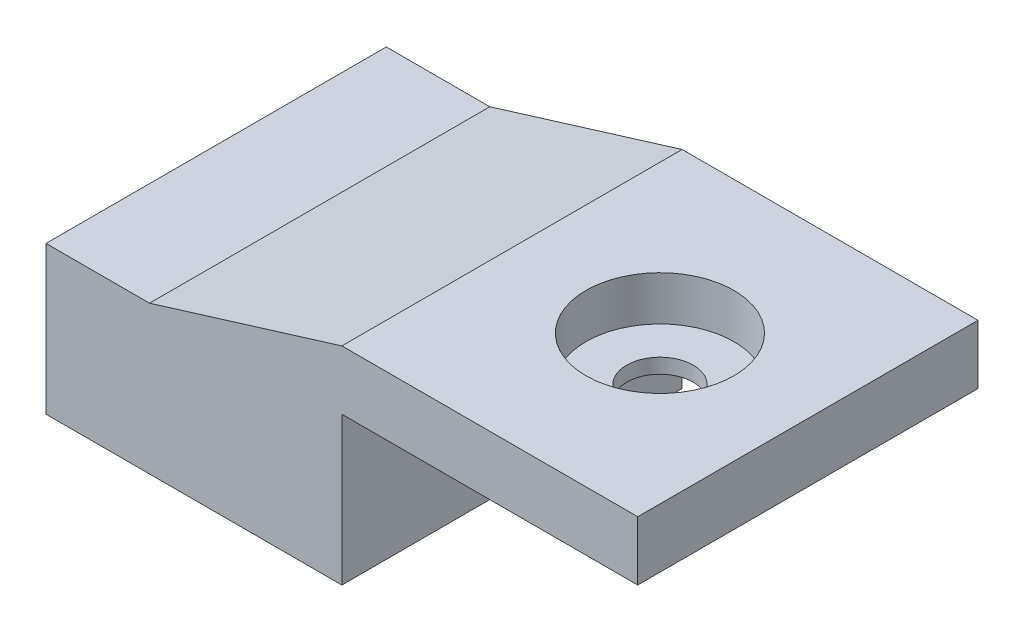
ISO-10303-21;
HEADER;
FILE_DESCRIPTION(('STEP AP214'),'2;1');
FILE_NAME('part.step','',(''),(''),'','','');
FILE_SCHEMA(('AUTOMOTIVE_DESIGN { 1 0 10303 214 1 1 1 1 }'));
ENDSEC;
DATA;
#1=APPLICATION_CONTEXT('core data for automotive mechanical design processes');
#2=APPLICATION_PROTOCOL_DEFINITION('international standard','automotive_design',2000,#1);
#3=PRODUCT_CONTEXT('',#1,'mechanical');
#4=PRODUCT('Part','Part','',(#3));
#5=PRODUCT_RELATED_PRODUCT_CATEGORY('part','',(#4));
#6=PRODUCT_DEFINITION_FORMATION('','',#4);
#7=PRODUCT_DEFINITION_CONTEXT('part definition',#1,'design');
#8=PRODUCT_DEFINITION('design','',#6,#7);
#9=PRODUCT_DEFINITION_SHAPE('','',#8);
#10=(LENGTH_UNIT() NAMED_UNIT(*) SI_UNIT(.MILLI.,.METRE.));
#11=(NAMED_UNIT(*) PLANE_ANGLE_UNIT() SI_UNIT($,.RADIAN.));
#12=(NAMED_UNIT(*) SI_UNIT($,.STERADIAN.) SOLID_ANGLE_UNIT());
#13=UNCERTAINTY_MEASURE_WITH_UNIT(LENGTH_MEASURE(1.E-05),#10,'distance_accuracy_value','');
#14=(GEOMETRIC_REPRESENTATION_CONTEXT(3) GLOBAL_UNCERTAINTY_ASSIGNED_CONTEXT((#13)) GLOBAL_UNIT_ASSIGNED_CONTEXT((#10,
#11,#12)) REPRESENTATION_CONTEXT('',''));
#15=CARTESIAN_POINT('',(0.,0.,0.));
#16=DIRECTION('',(0.,0.,1.));
#17=DIRECTION('',(1.,0.,0.));
#18=AXIS2_PLACEMENT_3D('',#15,#16,#17);
#19=CARTESIAN_POINT('',(0.,10.,23.));
#20=DIRECTION('',(1.,0.,0.));
#21=DIRECTION('',(0.,0.,-1.));
#22=AXIS2_PLACEMENT_3D('',#19,#20,#21);
#23=PLANE('',#22);
#24=CARTESIAN_POINT('',(0.,3.886151,5.));
#25=DIRECTION('',(-1.,0.,0.));
#26=DIRECTION('',(0.,0.,1.));
#27=AXIS2_PLACEMENT_3D('',#24,#25,#26);
#28=CIRCLE('',#27,2.8);
#29=CARTESIAN_POINT('',(0.,3.886151,7.8));
#30=VERTEX_POINT('',#29);
#31=EDGE_CURVE('E194',#30,#30,#28,.T.);
#32=ORIENTED_EDGE('',*,*,#31,.F.);
#33=EDGE_LOOP('',(#32));
#34=FACE_BOUND('',#33,.T.);
#35=CARTESIAN_POINT('',(0.,3.886151,18.));
#36=DIRECTION('',(-1.,0.,0.));
#37=DIRECTION('',(0.,0.,1.));
#38=AXIS2_PLACEMENT_3D('',#35,#36,#37);
#39=CIRCLE('',#38,2.8);
#40=CARTESIAN_POINT('',(0.,3.886151,20.8));
#41=VERTEX_POINT('',#40);
#42=EDGE_CURVE('E188',#41,#41,#39,.T.);
#43=ORIENTED_EDGE('',*,*,#42,.F.);
#44=EDGE_LOOP('',(#43));
#45=FACE_BOUND('',#44,.T.);
#46=DIRECTION('',(0.,-1.,0.));
#47=VECTOR('',#46,1.);
#48=CARTESIAN_POINT('',(0.,10.,0.));
#49=LINE('',#48,#47);
#50=CARTESIAN_POINT('',(0.,10.,0.));
#51=VERTEX_POINT('',#50);
#52=CARTESIAN_POINT('',(0.,0.,0.));
#53=VERTEX_POINT('',#52);
#54=EDGE_CURVE('E137',#51,#53,#49,.T.);
#55=ORIENTED_EDGE('',*,*,#54,.T.);
#56=DIRECTION('',(0.,0.,-1.));
#57=VECTOR('',#56,1.);
#58=CARTESIAN_POINT('',(0.,0.,23.));
#59=LINE('',#58,#57);
#60=CARTESIAN_POINT('',(0.,0.,23.));
#61=VERTEX_POINT('',#60);
#62=EDGE_CURVE('E11',#61,#53,#59,.T.);
#63=ORIENTED_EDGE('',*,*,#62,.F.);
#64=DIRECTION('',(0.,-1.,0.));
#65=VECTOR('',#64,1.);
#66=CARTESIAN_POINT('',(0.,10.,23.));
#67=LINE('',#66,#65);
#68=CARTESIAN_POINT('',(0.,10.,23.));
#69=VERTEX_POINT('',#68);
#70=EDGE_CURVE('E152',#69,#61,#67,.T.);
#71=ORIENTED_EDGE('',*,*,#70,.F.);
#72=DIRECTION('',(0.,0.,-1.));
#73=VECTOR('',#72,1.);
#74=CARTESIAN_POINT('',(0.,10.,23.));
#75=LINE('',#74,#73);
#76=EDGE_CURVE('E133',#69,#51,#75,.T.);
#77=ORIENTED_EDGE('',*,*,#76,.T.);
#78=EDGE_LOOP('',(#55,#63,#71,#77));
#79=FACE_BOUND('',#78,.T.);
#80=ADVANCED_FACE('F37',(#34,#45,#79),#23,.F.);
#81=CARTESIAN_POINT('',(0.,0.,23.));
#82=DIRECTION('',(0.,1.,0.));
#83=DIRECTION('',(0.,0.,1.));
#84=AXIS2_PLACEMENT_3D('',#81,#82,#83);
#85=PLANE('',#84);
#86=DIRECTION('',(1.,0.,0.));
#87=VECTOR('',#86,1.);
#88=CARTESIAN_POINT('',(0.,0.,0.));
#89=LINE('',#88,#87);
#90=CARTESIAN_POINT('',(20.,0.,0.));
#91=VERTEX_POINT('',#90);
#92=EDGE_CURVE('E140',#53,#91,#89,.T.);
#93=ORIENTED_EDGE('',*,*,#92,.T.);
#94=DIRECTION('',(0.,0.,-1.));
#95=VECTOR('',#94,1.);
#96=CARTESIAN_POINT('',(20.,0.,23.));
#97=LINE('',#96,#95);
#98=CARTESIAN_POINT('',(20.,0.,23.));
#99=VERTEX_POINT('',#98);
#100=EDGE_CURVE('E46',#99,#91,#97,.T.);
#101=ORIENTED_EDGE('',*,*,#100,.F.);
#102=DIRECTION('',(1.,0.,0.));
#103=VECTOR('',#102,1.);
#104=CARTESIAN_POINT('',(0.,0.,23.));
#105=LINE('',#104,#103);
#106=EDGE_CURVE('E98',#61,#99,#105,.T.);
#107=ORIENTED_EDGE('',*,*,#106,.F.);
#108=ORIENTED_EDGE('',*,*,#62,.T.);
#109=EDGE_LOOP('',(#93,#101,#107,#108));
#110=FACE_BOUND('',#109,.T.);
#111=ADVANCED_FACE('F219',(#110),#85,.F.);
#112=CARTESIAN_POINT('',(20.,0.,23.));
#113=DIRECTION('',(-1.,0.,0.));
#114=DIRECTION('',(0.,0.,1.));
#115=AXIS2_PLACEMENT_3D('',#112,#113,#114);
#116=PLANE('',#115);
#117=DIRECTION('',(0.,1.,0.));
#118=VECTOR('',#117,1.);
#119=CARTESIAN_POINT('',(20.,0.,0.));
#120=LINE('',#119,#118);
#121=CARTESIAN_POINT('',(20.,10.,0.));
#122=VERTEX_POINT('',#121);
#123=EDGE_CURVE('E143',#91,#122,#120,.T.);
#124=ORIENTED_EDGE('',*,*,#123,.T.);
#125=DIRECTION('',(0.,0.,-1.));
#126=VECTOR('',#125,1.);
#127=CARTESIAN_POINT('',(20.,10.,23.));
#128=LINE('',#127,#126);
#129=CARTESIAN_POINT('',(20.,10.,23.));
#130=VERTEX_POINT('',#129);
#131=EDGE_CURVE('E159',#130,#122,#128,.T.);
#132=ORIENTED_EDGE('',*,*,#131,.F.);
#133=DIRECTION('',(0.,1.,0.));
#134=VECTOR('',#133,1.);
#135=CARTESIAN_POINT('',(20.,0.,23.));
#136=LINE('',#135,#134);
#137=EDGE_CURVE('E168',#99,#130,#136,.T.);
#138=ORIENTED_EDGE('',*,*,#137,.F.);
#139=ORIENTED_EDGE('',*,*,#100,.T.);
#140=EDGE_LOOP('',(#124,#132,#138,#139));
#141=FACE_BOUND('',#140,.T.);
#142=ADVANCED_FACE('F166',(#141),#116,.F.);
#143=CARTESIAN_POINT('',(20.,10.,23.));
#144=DIRECTION('',(0.,1.,0.));
#145=DIRECTION('',(0.,0.,1.));
#146=AXIS2_PLACEMENT_3D('',#143,#144,#145);
#147=PLANE('',#146);
#148=CARTESIAN_POINT('',(30.,10.,11.5));
#149=DIRECTION('',(0.,1.,0.));
#150=DIRECTION('',(0.,0.,1.));
#151=AXIS2_PLACEMENT_3D('',#148,#149,#150);
#152=CIRCLE('',#151,2.25);
#153=CARTESIAN_POINT('',(30.,10.,13.75));
#154=VERTEX_POINT('',#153);
#155=EDGE_CURVE('E40',#154,#154,#152,.T.);
#156=ORIENTED_EDGE('',*,*,#155,.T.);
#157=EDGE_LOOP('',(#156));
#158=FACE_BOUND('',#157,.T.);
#159=DIRECTION('',(1.,0.,0.));
#160=VECTOR('',#159,1.);
#161=CARTESIAN_POINT('',(20.,10.,0.));
#162=LINE('',#161,#160);
#163=CARTESIAN_POINT('',(40.,10.,0.));
#164=VERTEX_POINT('',#163);
#165=EDGE_CURVE('E145',#122,#164,#162,.T.);
#166=ORIENTED_EDGE('',*,*,#165,.T.);
#167=DIRECTION('',(0.,0.,-1.));
#168=VECTOR('',#167,1.);
#169=CARTESIAN_POINT('',(40.,10.,23.));
#170=LINE('',#169,#168);
#171=CARTESIAN_POINT('',(40.,10.,23.));
#172=VERTEX_POINT('',#171);
#173=EDGE_CURVE('E156',#172,#164,#170,.T.);
#174=ORIENTED_EDGE('',*,*,#173,.F.);
#175=DIRECTION('',(1.,0.,0.));
#176=VECTOR('',#175,1.);
#177=CARTESIAN_POINT('',(20.,10.,23.));
#178=LINE('',#177,#176);
#179=EDGE_CURVE('E180',#130,#172,#178,.T.);
#180=ORIENTED_EDGE('',*,*,#179,.F.);
#181=ORIENTED_EDGE('',*,*,#131,.T.);
#182=EDGE_LOOP('',(#166,#174,#180,#181));
#183=FACE_BOUND('',#182,.T.);
#184=ADVANCED_FACE('F176',(#158,#183),#147,.F.);
#185=CARTESIAN_POINT('',(40.,10.,23.));
#186=DIRECTION('',(-1.,0.,0.));
#187=DIRECTION('',(0.,-1.,0.));
#188=AXIS2_PLACEMENT_3D('',#185,#186,#187);
#189=PLANE('',#188);
#190=DIRECTION('',(0.,1.,0.));
#191=VECTOR('',#190,1.);
#192=CARTESIAN_POINT('',(40.,10.,0.));
#193=LINE('',#192,#191);
#194=CARTESIAN_POINT('',(40.,14.,0.));
#195=VERTEX_POINT('',#194);
#196=EDGE_CURVE('E147',#164,#195,#193,.T.);
#197=ORIENTED_EDGE('',*,*,#196,.T.);
#198=DIRECTION('',(0.,0.,-1.));
#199=VECTOR('',#198,1.);
#200=CARTESIAN_POINT('',(40.,14.,23.));
#201=LINE('',#200,#199);
#202=CARTESIAN_POINT('',(40.,14.,23.));
#203=VERTEX_POINT('',#202);
#204=EDGE_CURVE('E128',#203,#195,#201,.T.);
#205=ORIENTED_EDGE('',*,*,#204,.F.);
#206=DIRECTION('',(0.,1.,0.));
#207=VECTOR('',#206,1.);
#208=CARTESIAN_POINT('',(40.,10.,23.));
#209=LINE('',#208,#207);
#210=EDGE_CURVE('E119',#172,#203,#209,.T.);
#211=ORIENTED_EDGE('',*,*,#210,.F.);
#212=ORIENTED_EDGE('',*,*,#173,.T.);
#213=EDGE_LOOP('',(#197,#205,#211,#212));
#214=FACE_BOUND('',#213,.T.);
#215=ADVANCED_FACE('F179',(#214),#189,.F.);
#216=CARTESIAN_POINT('',(40.,14.,23.));
#217=DIRECTION('',(0.,-1.,0.));
#218=DIRECTION('',(1.,0.,0.));
#219=AXIS2_PLACEMENT_3D('',#216,#217,#218);
#220=PLANE('',#219);
#221=CARTESIAN_POINT('',(30.,14.,11.5));
#222=DIRECTION('',(0.,1.,0.));
#223=DIRECTION('',(0.,0.,1.));
#224=AXIS2_PLACEMENT_3D('',#221,#222,#223);
#225=CIRCLE('',#224,5.);
#226=CARTESIAN_POINT('',(30.,14.,16.5));
#227=VERTEX_POINT('',#226);
#228=EDGE_CURVE('E203',#227,#227,#225,.T.);
#229=ORIENTED_EDGE('',*,*,#228,.F.);
#230=EDGE_LOOP('',(#229));
#231=FACE_BOUND('',#230,.T.);
#232=DIRECTION('',(-1.,0.,0.));
#233=VECTOR('',#232,1.);
#234=CARTESIAN_POINT('',(40.,14.,0.));
#235=LINE('',#234,#233);
#236=CARTESIAN_POINT('',(20.,14.,0.));
#237=VERTEX_POINT('',#236);
#238=EDGE_CURVE('E127',#195,#237,#235,.T.);
#239=ORIENTED_EDGE('',*,*,#238,.T.);
#240=DIRECTION('',(0.,0.,-1.));
#241=VECTOR('',#240,1.);
#242=CARTESIAN_POINT('',(20.,14.,23.));
#243=LINE('',#242,#241);
#244=CARTESIAN_POINT('',(20.,14.,23.));
#245=VERTEX_POINT('',#244);
#246=EDGE_CURVE('E124',#245,#237,#243,.T.);
#247=ORIENTED_EDGE('',*,*,#246,.F.);
#248=DIRECTION('',(-1.,0.,0.));
#249=VECTOR('',#248,1.);
#250=CARTESIAN_POINT('',(40.,14.,23.));
#251=LINE('',#250,#249);
#252=EDGE_CURVE('E113',#203,#245,#251,.T.);
#253=ORIENTED_EDGE('',*,*,#252,.F.);
#254=ORIENTED_EDGE('',*,*,#204,.T.);
#255=EDGE_LOOP('',(#239,#247,#253,#254));
#256=FACE_BOUND('',#255,.T.);
#257=ADVANCED_FACE('F125',(#231,#256),#220,.F.);
#258=CARTESIAN_POINT('',(7.,10.,23.));
#259=DIRECTION('',(0.294085848837523,-0.95577900872195,0.));
#260=DIRECTION('',(0.95577900872195,0.294085848837523,0.));
#261=AXIS2_PLACEMENT_3D('',#258,#259,#260);
#262=PLANE('',#261);
#263=DIRECTION('',(-0.95577900872195,-0.294085848837524,0.));
#264=VECTOR('',#263,1.);
#265=CARTESIAN_POINT('',(7.,10.,0.));
#266=LINE('',#265,#264);
#267=CARTESIAN_POINT('',(7.,10.,0.));
#268=VERTEX_POINT('',#267);
#269=EDGE_CURVE('E84',#237,#268,#266,.T.);
#270=ORIENTED_EDGE('',*,*,#269,.T.);
#271=DIRECTION('',(0.,0.,-1.));
#272=VECTOR('',#271,1.);
#273=CARTESIAN_POINT('',(7.,10.,23.));
#274=LINE('',#273,#272);
#275=CARTESIAN_POINT('',(7.,10.,23.));
#276=VERTEX_POINT('',#275);
#277=EDGE_CURVE('E129',#276,#268,#274,.T.);
#278=ORIENTED_EDGE('',*,*,#277,.F.);
#279=DIRECTION('',(-0.95577900872195,-0.294085848837524,0.));
#280=VECTOR('',#279,1.);
#281=CARTESIAN_POINT('',(7.,10.,23.));
#282=LINE('',#281,#280);
#283=EDGE_CURVE('E117',#245,#276,#282,.T.);
#284=ORIENTED_EDGE('',*,*,#283,.F.);
#285=ORIENTED_EDGE('',*,*,#246,.T.);
#286=EDGE_LOOP('',(#270,#278,#284,#285));
#287=FACE_BOUND('',#286,.T.);
#288=ADVANCED_FACE('F131',(#287),#262,.F.);
#289=CARTESIAN_POINT('',(0.,10.,23.));
#290=DIRECTION('',(0.,-1.,0.));
#291=DIRECTION('',(0.,0.,-1.));
#292=AXIS2_PLACEMENT_3D('',#289,#290,#291);
#293=PLANE('',#292);
#294=DIRECTION('',(-1.,0.,0.));
#295=VECTOR('',#294,1.);
#296=CARTESIAN_POINT('',(0.,10.,0.));
#297=LINE('',#296,#295);
#298=EDGE_CURVE('E90',#268,#51,#297,.T.);
#299=ORIENTED_EDGE('',*,*,#298,.T.);
#300=ORIENTED_EDGE('',*,*,#76,.F.);
#301=DIRECTION('',(-1.,0.,0.));
#302=VECTOR('',#301,1.);
#303=CARTESIAN_POINT('',(0.,10.,23.));
#304=LINE('',#303,#302);
#305=EDGE_CURVE('E54',#276,#69,#304,.T.);
#306=ORIENTED_EDGE('',*,*,#305,.F.);
#307=ORIENTED_EDGE('',*,*,#277,.T.);
#308=EDGE_LOOP('',(#299,#300,#306,#307));
#309=FACE_BOUND('',#308,.T.);
#310=ADVANCED_FACE('F215',(#309),#293,.F.);
#311=CARTESIAN_POINT('',(0.,0.,23.));
#312=DIRECTION('',(0.,0.,1.));
#313=DIRECTION('',(1.,0.,0.));
#314=AXIS2_PLACEMENT_3D('',#311,#312,#313);
#315=PLANE('',#314);
#316=ORIENTED_EDGE('',*,*,#70,.T.);
#317=ORIENTED_EDGE('',*,*,#106,.T.);
#318=ORIENTED_EDGE('',*,*,#137,.T.);
#319=ORIENTED_EDGE('',*,*,#179,.T.);
#320=ORIENTED_EDGE('',*,*,#210,.T.);
#321=ORIENTED_EDGE('',*,*,#252,.T.);
#322=ORIENTED_EDGE('',*,*,#283,.T.);
#323=ORIENTED_EDGE('',*,*,#305,.T.);
#324=EDGE_LOOP('',(#316,#317,#318,#319,#320,#321,#322,#323));
#325=FACE_BOUND('',#324,.T.);
#326=ADVANCED_FACE('F115',(#325),#315,.T.);
#327=CARTESIAN_POINT('',(0.,0.,0.));
#328=DIRECTION('',(0.,0.,1.));
#329=DIRECTION('',(1.,0.,0.));
#330=AXIS2_PLACEMENT_3D('',#327,#328,#329);
#331=PLANE('',#330);
#332=ORIENTED_EDGE('',*,*,#54,.F.);
#333=ORIENTED_EDGE('',*,*,#298,.F.);
#334=ORIENTED_EDGE('',*,*,#269,.F.);
#335=ORIENTED_EDGE('',*,*,#238,.F.);
#336=ORIENTED_EDGE('',*,*,#196,.F.);
#337=ORIENTED_EDGE('',*,*,#165,.F.);
#338=ORIENTED_EDGE('',*,*,#123,.F.);
#339=ORIENTED_EDGE('',*,*,#92,.F.);
#340=EDGE_LOOP('',(#332,#333,#334,#335,#336,#337,#338,#339));
#341=FACE_BOUND('',#340,.T.);
#342=ADVANCED_FACE('F172',(#341),#331,.F.);
#343=CARTESIAN_POINT('',(10.,3.886151,18.));
#344=DIRECTION('',(-1.,0.,0.));
#345=DIRECTION('',(0.,0.,1.));
#346=AXIS2_PLACEMENT_3D('',#343,#344,#345);
#347=CONICAL_SURFACE('',#346,2.8,1.02974425867665);
#348=CARTESIAN_POINT('',(11.6824097332772,3.886151,18.));
#349=VERTEX_POINT('',#348);
#350=VERTEX_LOOP('',#349);
#351=FACE_BOUND('',#350,.T.);
#352=CARTESIAN_POINT('',(10.,3.886151,18.));
#353=DIRECTION('',(-1.,0.,0.));
#354=DIRECTION('',(0.,0.,1.));
#355=AXIS2_PLACEMENT_3D('',#352,#353,#354);
#356=CIRCLE('',#355,2.8);
#357=CARTESIAN_POINT('',(10.,3.886151,20.8));
#358=VERTEX_POINT('',#357);
#359=EDGE_CURVE('E141',#358,#358,#356,.T.);
#360=ORIENTED_EDGE('',*,*,#359,.T.);
#361=EDGE_LOOP('',(#360));
#362=FACE_BOUND('',#361,.T.);
#363=ADVANCED_FACE('F238',(#351,#362),#347,.F.);
#364=CARTESIAN_POINT('',(0.,3.886151,18.));
#365=DIRECTION('',(-1.,0.,0.));
#366=DIRECTION('',(0.,0.,1.));
#367=AXIS2_PLACEMENT_3D('',#364,#365,#366);
#368=CYLINDRICAL_SURFACE('',#367,2.8);
#369=ORIENTED_EDGE('',*,*,#359,.F.);
#370=EDGE_LOOP('',(#369));
#371=FACE_BOUND('',#370,.T.);
#372=ORIENTED_EDGE('',*,*,#42,.T.);
#373=EDGE_LOOP('',(#372));
#374=FACE_BOUND('',#373,.T.);
#375=ADVANCED_FACE('F242',(#371,#374),#368,.F.);
#376=CARTESIAN_POINT('',(10.,3.886151,5.));
#377=DIRECTION('',(-1.,0.,0.));
#378=DIRECTION('',(0.,0.,1.));
#379=AXIS2_PLACEMENT_3D('',#376,#377,#378);
#380=CONICAL_SURFACE('',#379,2.8,1.02974425867665);
#381=CARTESIAN_POINT('',(11.6824097332772,3.886151,5.));
#382=VERTEX_POINT('',#381);
#383=VERTEX_LOOP('',#382);
#384=FACE_BOUND('',#383,.T.);
#385=CARTESIAN_POINT('',(10.,3.886151,5.));
#386=DIRECTION('',(-1.,0.,0.));
#387=DIRECTION('',(0.,0.,1.));
#388=AXIS2_PLACEMENT_3D('',#385,#386,#387);
#389=CIRCLE('',#388,2.8);
#390=CARTESIAN_POINT('',(10.,3.886151,7.8));
#391=VERTEX_POINT('',#390);
#392=EDGE_CURVE('E191',#391,#391,#389,.T.);
#393=ORIENTED_EDGE('',*,*,#392,.T.);
#394=EDGE_LOOP('',(#393));
#395=FACE_BOUND('',#394,.T.);
#396=ADVANCED_FACE('F246',(#384,#395),#380,.F.);
#397=CARTESIAN_POINT('',(0.,3.886151,5.));
#398=DIRECTION('',(-1.,0.,0.));
#399=DIRECTION('',(0.,0.,1.));
#400=AXIS2_PLACEMENT_3D('',#397,#398,#399);
#401=CYLINDRICAL_SURFACE('',#400,2.8);
#402=ORIENTED_EDGE('',*,*,#392,.F.);
#403=EDGE_LOOP('',(#402));
#404=FACE_BOUND('',#403,.T.);
#405=ORIENTED_EDGE('',*,*,#31,.T.);
#406=EDGE_LOOP('',(#405));
#407=FACE_BOUND('',#406,.T.);
#408=ADVANCED_FACE('F250',(#404,#407),#401,.F.);
#409=CARTESIAN_POINT('',(30.,14.,11.5));
#410=DIRECTION('',(0.,1.,0.));
#411=DIRECTION('',(0.,0.,1.));
#412=AXIS2_PLACEMENT_3D('',#409,#410,#411);
#413=CYLINDRICAL_SURFACE('',#412,2.25);
#414=CARTESIAN_POINT('',(30.,11.,11.5));
#415=DIRECTION('',(0.,1.,0.));
#416=DIRECTION('',(0.,0.,1.));
#417=AXIS2_PLACEMENT_3D('',#414,#415,#416);
#418=CIRCLE('',#417,2.25);
#419=CARTESIAN_POINT('',(30.,11.,13.75));
#420=VERTEX_POINT('',#419);
#421=EDGE_CURVE('E197',#420,#420,#418,.T.);
#422=ORIENTED_EDGE('',*,*,#421,.T.);
#423=EDGE_LOOP('',(#422));
#424=FACE_BOUND('',#423,.T.);
#425=ORIENTED_EDGE('',*,*,#155,.F.);
#426=EDGE_LOOP('',(#425));
#427=FACE_BOUND('',#426,.T.);
#428=ADVANCED_FACE('F254',(#424,#427),#413,.F.);
#429=CARTESIAN_POINT('',(32.25,11.,11.5));
#430=DIRECTION('',(0.,-1.,0.));
#431=DIRECTION('',(0.,0.,-1.));
#432=AXIS2_PLACEMENT_3D('',#429,#430,#431);
#433=PLANE('',#432);
#434=ORIENTED_EDGE('',*,*,#421,.F.);
#435=EDGE_LOOP('',(#434));
#436=FACE_BOUND('',#435,.T.);
#437=CARTESIAN_POINT('',(30.,11.,11.5));
#438=DIRECTION('',(0.,1.,0.));
#439=DIRECTION('',(0.,0.,1.));
#440=AXIS2_PLACEMENT_3D('',#437,#438,#439);
#441=CIRCLE('',#440,5.);
#442=CARTESIAN_POINT('',(30.,11.,16.5));
#443=VERTEX_POINT('',#442);
#444=EDGE_CURVE('E200',#443,#443,#441,.T.);
#445=ORIENTED_EDGE('',*,*,#444,.T.);
#446=EDGE_LOOP('',(#445));
#447=FACE_BOUND('',#446,.T.);
#448=ADVANCED_FACE('F258',(#436,#447),#433,.F.);
#449=CARTESIAN_POINT('',(30.,14.,11.5));
#450=DIRECTION('',(0.,1.,0.));
#451=DIRECTION('',(0.,0.,1.));
#452=AXIS2_PLACEMENT_3D('',#449,#450,#451);
#453=CYLINDRICAL_SURFACE('',#452,5.);
#454=ORIENTED_EDGE('',*,*,#444,.F.);
#455=EDGE_LOOP('',(#454));
#456=FACE_BOUND('',#455,.T.);
#457=ORIENTED_EDGE('',*,*,#228,.T.);
#458=EDGE_LOOP('',(#457));
#459=FACE_BOUND('',#458,.T.);
#460=ADVANCED_FACE('F207',(#456,#459),#453,.F.);
#461=CLOSED_SHELL('',(#80,#111,#142,#184,#215,#257,#288,#310,#326,#342,#363,#375,#396,#408,#428,
#448,#460));
#462=MANIFOLD_SOLID_BREP('B2',#461);
#463=ADVANCED_BREP_SHAPE_REPRESENTATION('',(#18,#462),#14);
#464=SHAPE_DEFINITION_REPRESENTATION(#9,#463);
ENDSEC;
END-ISO-10303-21;
